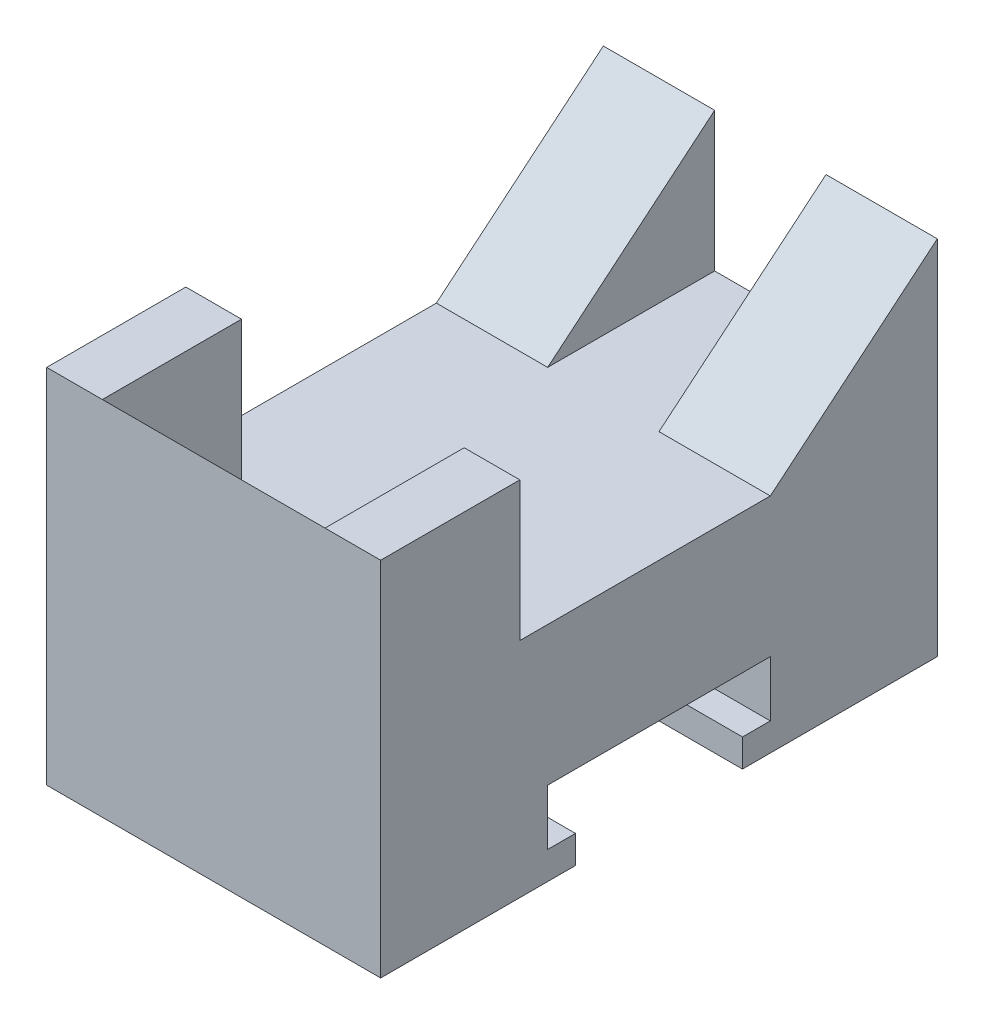
ISO-10303-21;
HEADER;
FILE_DESCRIPTION(('STEP AP214'),'2;1');
FILE_NAME('part.step','',(''),(''),'','','');
FILE_SCHEMA(('AUTOMOTIVE_DESIGN { 1 0 10303 214 1 1 1 1 }'));
ENDSEC;
DATA;
#1=APPLICATION_CONTEXT('core data for automotive mechanical design processes');
#2=APPLICATION_PROTOCOL_DEFINITION('international standard','automotive_design',2000,#1);
#3=PRODUCT_CONTEXT('',#1,'mechanical');
#4=PRODUCT('Part','Part','',(#3));
#5=PRODUCT_RELATED_PRODUCT_CATEGORY('part','',(#4));
#6=PRODUCT_DEFINITION_FORMATION('','',#4);
#7=PRODUCT_DEFINITION_CONTEXT('part definition',#1,'design');
#8=PRODUCT_DEFINITION('design','',#6,#7);
#9=PRODUCT_DEFINITION_SHAPE('','',#8);
#10=(LENGTH_UNIT() NAMED_UNIT(*) SI_UNIT(.MILLI.,.METRE.));
#11=(NAMED_UNIT(*) PLANE_ANGLE_UNIT() SI_UNIT($,.RADIAN.));
#12=(NAMED_UNIT(*) SI_UNIT($,.STERADIAN.) SOLID_ANGLE_UNIT());
#13=UNCERTAINTY_MEASURE_WITH_UNIT(LENGTH_MEASURE(1.E-05),#10,'distance_accuracy_value','');
#14=(GEOMETRIC_REPRESENTATION_CONTEXT(3) GLOBAL_UNCERTAINTY_ASSIGNED_CONTEXT((#13)) GLOBAL_UNIT_ASSIGNED_CONTEXT((#10,
#11,#12)) REPRESENTATION_CONTEXT('',''));
#15=CARTESIAN_POINT('',(0.,0.,0.));
#16=DIRECTION('',(0.,0.,1.));
#17=DIRECTION('',(1.,0.,0.));
#18=AXIS2_PLACEMENT_3D('',#15,#16,#17);
#19=CARTESIAN_POINT('',(-150.,200.,150.));
#20=DIRECTION('',(0.,0.768221279597376,0.64018439966448));
#21=DIRECTION('',(0.,-0.64018439966448,0.768221279597376));
#22=AXIS2_PLACEMENT_3D('',#19,#20,#21);
#23=PLANE('',#22);
#24=DIRECTION('',(0.,0.64018439966448,-0.768221279597376));
#25=VECTOR('',#24,1.);
#26=CARTESIAN_POINT('',(50.,200.,150.));
#27=LINE('',#26,#25);
#28=CARTESIAN_POINT('',(50.,200.,150.));
#29=VERTEX_POINT('',#28);
#30=CARTESIAN_POINT('',(50.,325.,0.));
#31=VERTEX_POINT('',#30);
#32=EDGE_CURVE('E11',#29,#31,#27,.T.);
#33=ORIENTED_EDGE('',*,*,#32,.F.);
#34=DIRECTION('',(1.,0.,0.));
#35=VECTOR('',#34,1.);
#36=CARTESIAN_POINT('',(-150.,200.,150.));
#37=LINE('',#36,#35);
#38=CARTESIAN_POINT('',(150.,200.,150.));
#39=VERTEX_POINT('',#38);
#40=EDGE_CURVE('E188',#29,#39,#37,.T.);
#41=ORIENTED_EDGE('',*,*,#40,.T.);
#42=DIRECTION('',(0.,-0.64018439966448,0.768221279597376));
#43=VECTOR('',#42,1.);
#44=CARTESIAN_POINT('',(150.,200.,150.));
#45=LINE('',#44,#43);
#46=CARTESIAN_POINT('',(150.,325.,0.));
#47=VERTEX_POINT('',#46);
#48=EDGE_CURVE('E257',#47,#39,#45,.T.);
#49=ORIENTED_EDGE('',*,*,#48,.F.);
#50=DIRECTION('',(1.,0.,0.));
#51=VECTOR('',#50,1.);
#52=CARTESIAN_POINT('',(-150.,325.,0.));
#53=LINE('',#52,#51);
#54=EDGE_CURVE('E355',#31,#47,#53,.T.);
#55=ORIENTED_EDGE('',*,*,#54,.F.);
#56=EDGE_LOOP('',(#33,#41,#49,#55));
#57=FACE_BOUND('',#56,.T.);
#58=ADVANCED_FACE('F39',(#57),#23,.T.);
#59=CARTESIAN_POINT('',(-150.,325.,500.));
#60=DIRECTION('',(0.,0.707106781186548,-0.707106781186548));
#61=DIRECTION('',(0.,0.707106781186548,0.707106781186548));
#62=AXIS2_PLACEMENT_3D('',#59,#60,#61);
#63=PLANE('',#62);
#64=DIRECTION('',(1.,0.,0.));
#65=VECTOR('',#64,1.);
#66=CARTESIAN_POINT('',(-150.,200.,375.));
#67=LINE('',#66,#65);
#68=CARTESIAN_POINT('',(-100.,200.,375.));
#69=VERTEX_POINT('',#68);
#70=CARTESIAN_POINT('',(100.,200.,375.));
#71=VERTEX_POINT('',#70);
#72=EDGE_CURVE('E396',#69,#71,#67,.T.);
#73=ORIENTED_EDGE('',*,*,#72,.F.);
#74=DIRECTION('',(0.,0.707106781186548,0.707106781186548));
#75=VECTOR('',#74,1.);
#76=CARTESIAN_POINT('',(-100.,325.,500.));
#77=LINE('',#76,#75);
#78=CARTESIAN_POINT('',(-100.,325.,500.));
#79=VERTEX_POINT('',#78);
#80=EDGE_CURVE('E224',#69,#79,#77,.T.);
#81=ORIENTED_EDGE('',*,*,#80,.T.);
#82=DIRECTION('',(1.,0.,0.));
#83=VECTOR('',#82,1.);
#84=CARTESIAN_POINT('',(-150.,325.,500.));
#85=LINE('',#84,#83);
#86=CARTESIAN_POINT('',(100.,325.,500.));
#87=VERTEX_POINT('',#86);
#88=EDGE_CURVE('E391',#79,#87,#85,.T.);
#89=ORIENTED_EDGE('',*,*,#88,.T.);
#90=DIRECTION('',(0.,-0.707106781186548,-0.707106781186548));
#91=VECTOR('',#90,1.);
#92=CARTESIAN_POINT('',(100.,325.,500.));
#93=LINE('',#92,#91);
#94=EDGE_CURVE('E359',#87,#71,#93,.T.);
#95=ORIENTED_EDGE('',*,*,#94,.T.);
#96=EDGE_LOOP('',(#73,#81,#89,#95));
#97=FACE_BOUND('',#96,.T.);
#98=ADVANCED_FACE('F433',(#97),#63,.T.);
#99=CARTESIAN_POINT('',(-150.,325.,0.));
#100=DIRECTION('',(0.,0.,-1.));
#101=DIRECTION('',(0.,1.,0.));
#102=AXIS2_PLACEMENT_3D('',#99,#100,#101);
#103=PLANE('',#102);
#104=DIRECTION('',(0.,-1.,0.));
#105=VECTOR('',#104,1.);
#106=CARTESIAN_POINT('',(50.,325.,0.));
#107=LINE('',#106,#105);
#108=CARTESIAN_POINT('',(50.,200.,0.));
#109=VERTEX_POINT('',#108);
#110=EDGE_CURVE('E195',#31,#109,#107,.T.);
#111=ORIENTED_EDGE('',*,*,#110,.F.);
#112=ORIENTED_EDGE('',*,*,#54,.T.);
#113=DIRECTION('',(0.,1.,0.));
#114=VECTOR('',#113,1.);
#115=CARTESIAN_POINT('',(150.,325.,0.));
#116=LINE('',#115,#114);
#117=CARTESIAN_POINT('',(150.,0.,0.));
#118=VERTEX_POINT('',#117);
#119=EDGE_CURVE('E253',#118,#47,#116,.T.);
#120=ORIENTED_EDGE('',*,*,#119,.F.);
#121=DIRECTION('',(1.,0.,0.));
#122=VECTOR('',#121,1.);
#123=CARTESIAN_POINT('',(-150.,0.,0.));
#124=LINE('',#123,#122);
#125=CARTESIAN_POINT('',(-150.,0.,0.));
#126=VERTEX_POINT('',#125);
#127=EDGE_CURVE('E356',#126,#118,#124,.T.);
#128=ORIENTED_EDGE('',*,*,#127,.F.);
#129=DIRECTION('',(0.,1.,0.));
#130=VECTOR('',#129,1.);
#131=CARTESIAN_POINT('',(-150.,325.,0.));
#132=LINE('',#131,#130);
#133=CARTESIAN_POINT('',(-150.,325.,0.));
#134=VERTEX_POINT('',#133);
#135=EDGE_CURVE('E304',#126,#134,#132,.T.);
#136=ORIENTED_EDGE('',*,*,#135,.T.);
#137=CARTESIAN_POINT('',(-50.,325.,0.));
#138=VERTEX_POINT('',#137);
#139=EDGE_CURVE('E401',#134,#138,#53,.T.);
#140=ORIENTED_EDGE('',*,*,#139,.T.);
#141=DIRECTION('',(0.,1.,0.));
#142=VECTOR('',#141,1.);
#143=CARTESIAN_POINT('',(-50.,325.,0.));
#144=LINE('',#143,#142);
#145=CARTESIAN_POINT('',(-50.,200.,0.));
#146=VERTEX_POINT('',#145);
#147=EDGE_CURVE('E192',#146,#138,#144,.T.);
#148=ORIENTED_EDGE('',*,*,#147,.F.);
#149=DIRECTION('',(-1.,0.,0.));
#150=VECTOR('',#149,1.);
#151=CARTESIAN_POINT('',(50.,200.,0.));
#152=LINE('',#151,#150);
#153=EDGE_CURVE('E185',#109,#146,#152,.T.);
#154=ORIENTED_EDGE('',*,*,#153,.F.);
#155=EDGE_LOOP('',(#111,#112,#120,#128,#136,#140,#148,#154));
#156=FACE_BOUND('',#155,.T.);
#157=ADVANCED_FACE('F41',(#156),#103,.T.);
#158=CARTESIAN_POINT('',(-150.,0.,0.));
#159=DIRECTION('',(0.,-1.,0.));
#160=DIRECTION('',(0.,0.,-1.));
#161=AXIS2_PLACEMENT_3D('',#158,#159,#160);
#162=PLANE('',#161);
#163=ORIENTED_EDGE('',*,*,#127,.T.);
#164=DIRECTION('',(0.,0.,-1.));
#165=VECTOR('',#164,1.);
#166=CARTESIAN_POINT('',(150.,0.,0.));
#167=LINE('',#166,#165);
#168=CARTESIAN_POINT('',(150.,0.,175.));
#169=VERTEX_POINT('',#168);
#170=EDGE_CURVE('E300',#169,#118,#167,.T.);
#171=ORIENTED_EDGE('',*,*,#170,.F.);
#172=DIRECTION('',(1.,0.,0.));
#173=VECTOR('',#172,1.);
#174=CARTESIAN_POINT('',(-150.,0.,175.));
#175=LINE('',#174,#173);
#176=CARTESIAN_POINT('',(-150.,0.,175.));
#177=VERTEX_POINT('',#176);
#178=EDGE_CURVE('E360',#177,#169,#175,.T.);
#179=ORIENTED_EDGE('',*,*,#178,.F.);
#180=DIRECTION('',(0.,0.,-1.));
#181=VECTOR('',#180,1.);
#182=CARTESIAN_POINT('',(-150.,0.,0.));
#183=LINE('',#182,#181);
#184=EDGE_CURVE('E351',#177,#126,#183,.T.);
#185=ORIENTED_EDGE('',*,*,#184,.T.);
#186=EDGE_LOOP('',(#163,#171,#179,#185));
#187=FACE_BOUND('',#186,.T.);
#188=ADVANCED_FACE('F449',(#187),#162,.T.);
#189=CARTESIAN_POINT('',(-150.,0.,175.));
#190=DIRECTION('',(0.,0.,1.));
#191=DIRECTION('',(1.,0.,0.));
#192=AXIS2_PLACEMENT_3D('',#189,#190,#191);
#193=PLANE('',#192);
#194=ORIENTED_EDGE('',*,*,#178,.T.);
#195=DIRECTION('',(0.,-1.,0.));
#196=VECTOR('',#195,1.);
#197=CARTESIAN_POINT('',(150.,0.,175.));
#198=LINE('',#197,#196);
#199=CARTESIAN_POINT('',(150.,25.,175.));
#200=VERTEX_POINT('',#199);
#201=EDGE_CURVE('E296',#200,#169,#198,.T.);
#202=ORIENTED_EDGE('',*,*,#201,.F.);
#203=DIRECTION('',(1.,0.,0.));
#204=VECTOR('',#203,1.);
#205=CARTESIAN_POINT('',(-150.,25.,175.));
#206=LINE('',#205,#204);
#207=CARTESIAN_POINT('',(-150.,25.,175.));
#208=VERTEX_POINT('',#207);
#209=EDGE_CURVE('E363',#208,#200,#206,.T.);
#210=ORIENTED_EDGE('',*,*,#209,.F.);
#211=DIRECTION('',(0.,-1.,0.));
#212=VECTOR('',#211,1.);
#213=CARTESIAN_POINT('',(-150.,0.,175.));
#214=LINE('',#213,#212);
#215=EDGE_CURVE('E347',#208,#177,#214,.T.);
#216=ORIENTED_EDGE('',*,*,#215,.T.);
#217=EDGE_LOOP('',(#194,#202,#210,#216));
#218=FACE_BOUND('',#217,.T.);
#219=ADVANCED_FACE('F530',(#218),#193,.T.);
#220=CARTESIAN_POINT('',(-150.,25.,175.));
#221=DIRECTION('',(0.,1.,0.));
#222=DIRECTION('',(0.,0.,1.));
#223=AXIS2_PLACEMENT_3D('',#220,#221,#222);
#224=PLANE('',#223);
#225=ORIENTED_EDGE('',*,*,#209,.T.);
#226=DIRECTION('',(0.,0.,1.));
#227=VECTOR('',#226,1.);
#228=CARTESIAN_POINT('',(150.,25.,175.));
#229=LINE('',#228,#227);
#230=CARTESIAN_POINT('',(150.,25.,150.));
#231=VERTEX_POINT('',#230);
#232=EDGE_CURVE('E292',#231,#200,#229,.T.);
#233=ORIENTED_EDGE('',*,*,#232,.F.);
#234=DIRECTION('',(1.,0.,0.));
#235=VECTOR('',#234,1.);
#236=CARTESIAN_POINT('',(-150.,25.,150.));
#237=LINE('',#236,#235);
#238=CARTESIAN_POINT('',(-150.,25.,150.));
#239=VERTEX_POINT('',#238);
#240=EDGE_CURVE('E366',#239,#231,#237,.T.);
#241=ORIENTED_EDGE('',*,*,#240,.F.);
#242=DIRECTION('',(0.,0.,1.));
#243=VECTOR('',#242,1.);
#244=CARTESIAN_POINT('',(-150.,25.,175.));
#245=LINE('',#244,#243);
#246=EDGE_CURVE('E343',#239,#208,#245,.T.);
#247=ORIENTED_EDGE('',*,*,#246,.T.);
#248=EDGE_LOOP('',(#225,#233,#241,#247));
#249=FACE_BOUND('',#248,.T.);
#250=ADVANCED_FACE('F456',(#249),#224,.T.);
#251=CARTESIAN_POINT('',(-150.,25.,150.));
#252=DIRECTION('',(0.,0.,1.));
#253=DIRECTION('',(1.,0.,0.));
#254=AXIS2_PLACEMENT_3D('',#251,#252,#253);
#255=PLANE('',#254);
#256=ORIENTED_EDGE('',*,*,#240,.T.);
#257=DIRECTION('',(0.,-1.,0.));
#258=VECTOR('',#257,1.);
#259=CARTESIAN_POINT('',(150.,25.,150.));
#260=LINE('',#259,#258);
#261=CARTESIAN_POINT('',(150.,75.,150.));
#262=VERTEX_POINT('',#261);
#263=EDGE_CURVE('E288',#262,#231,#260,.T.);
#264=ORIENTED_EDGE('',*,*,#263,.F.);
#265=DIRECTION('',(1.,0.,0.));
#266=VECTOR('',#265,1.);
#267=CARTESIAN_POINT('',(-150.,75.,150.));
#268=LINE('',#267,#266);
#269=CARTESIAN_POINT('',(-150.,75.,150.));
#270=VERTEX_POINT('',#269);
#271=EDGE_CURVE('E369',#270,#262,#268,.T.);
#272=ORIENTED_EDGE('',*,*,#271,.F.);
#273=DIRECTION('',(0.,-1.,0.));
#274=VECTOR('',#273,1.);
#275=CARTESIAN_POINT('',(-150.,25.,150.));
#276=LINE('',#275,#274);
#277=EDGE_CURVE('E339',#270,#239,#276,.T.);
#278=ORIENTED_EDGE('',*,*,#277,.T.);
#279=EDGE_LOOP('',(#256,#264,#272,#278));
#280=FACE_BOUND('',#279,.T.);
#281=ADVANCED_FACE('F460',(#280),#255,.T.);
#282=CARTESIAN_POINT('',(-150.,75.,150.));
#283=DIRECTION('',(0.,-1.,0.));
#284=DIRECTION('',(0.,0.,-1.));
#285=AXIS2_PLACEMENT_3D('',#282,#283,#284);
#286=PLANE('',#285);
#287=ORIENTED_EDGE('',*,*,#271,.T.);
#288=DIRECTION('',(0.,0.,-1.));
#289=VECTOR('',#288,1.);
#290=CARTESIAN_POINT('',(150.,75.,150.));
#291=LINE('',#290,#289);
#292=CARTESIAN_POINT('',(150.,75.,350.));
#293=VERTEX_POINT('',#292);
#294=EDGE_CURVE('E284',#293,#262,#291,.T.);
#295=ORIENTED_EDGE('',*,*,#294,.F.);
#296=DIRECTION('',(1.,0.,0.));
#297=VECTOR('',#296,1.);
#298=CARTESIAN_POINT('',(-150.,75.,350.));
#299=LINE('',#298,#297);
#300=CARTESIAN_POINT('',(-150.,75.,350.));
#301=VERTEX_POINT('',#300);
#302=EDGE_CURVE('E372',#301,#293,#299,.T.);
#303=ORIENTED_EDGE('',*,*,#302,.F.);
#304=DIRECTION('',(0.,0.,-1.));
#305=VECTOR('',#304,1.);
#306=CARTESIAN_POINT('',(-150.,75.,150.));
#307=LINE('',#306,#305);
#308=EDGE_CURVE('E335',#301,#270,#307,.T.);
#309=ORIENTED_EDGE('',*,*,#308,.T.);
#310=EDGE_LOOP('',(#287,#295,#303,#309));
#311=FACE_BOUND('',#310,.T.);
#312=ADVANCED_FACE('F464',(#311),#286,.T.);
#313=CARTESIAN_POINT('',(-150.,75.,350.));
#314=DIRECTION('',(0.,0.,-1.));
#315=DIRECTION('',(0.,1.,0.));
#316=AXIS2_PLACEMENT_3D('',#313,#314,#315);
#317=PLANE('',#316);
#318=ORIENTED_EDGE('',*,*,#302,.T.);
#319=DIRECTION('',(0.,1.,0.));
#320=VECTOR('',#319,1.);
#321=CARTESIAN_POINT('',(150.,75.,350.));
#322=LINE('',#321,#320);
#323=CARTESIAN_POINT('',(150.,25.,350.));
#324=VERTEX_POINT('',#323);
#325=EDGE_CURVE('E280',#324,#293,#322,.T.);
#326=ORIENTED_EDGE('',*,*,#325,.F.);
#327=DIRECTION('',(1.,0.,0.));
#328=VECTOR('',#327,1.);
#329=CARTESIAN_POINT('',(-150.,25.,350.));
#330=LINE('',#329,#328);
#331=CARTESIAN_POINT('',(-150.,25.,350.));
#332=VERTEX_POINT('',#331);
#333=EDGE_CURVE('E375',#332,#324,#330,.T.);
#334=ORIENTED_EDGE('',*,*,#333,.F.);
#335=DIRECTION('',(0.,1.,0.));
#336=VECTOR('',#335,1.);
#337=CARTESIAN_POINT('',(-150.,75.,350.));
#338=LINE('',#337,#336);
#339=EDGE_CURVE('E331',#332,#301,#338,.T.);
#340=ORIENTED_EDGE('',*,*,#339,.T.);
#341=EDGE_LOOP('',(#318,#326,#334,#340));
#342=FACE_BOUND('',#341,.T.);
#343=ADVANCED_FACE('F469',(#342),#317,.T.);
#344=CARTESIAN_POINT('',(-150.,25.,350.));
#345=DIRECTION('',(0.,1.,0.));
#346=DIRECTION('',(0.,0.,1.));
#347=AXIS2_PLACEMENT_3D('',#344,#345,#346);
#348=PLANE('',#347);
#349=ORIENTED_EDGE('',*,*,#333,.T.);
#350=DIRECTION('',(0.,0.,1.));
#351=VECTOR('',#350,1.);
#352=CARTESIAN_POINT('',(150.,25.,350.));
#353=LINE('',#352,#351);
#354=CARTESIAN_POINT('',(150.,25.,325.));
#355=VERTEX_POINT('',#354);
#356=EDGE_CURVE('E276',#355,#324,#353,.T.);
#357=ORIENTED_EDGE('',*,*,#356,.F.);
#358=DIRECTION('',(1.,0.,0.));
#359=VECTOR('',#358,1.);
#360=CARTESIAN_POINT('',(-150.,25.,325.));
#361=LINE('',#360,#359);
#362=CARTESIAN_POINT('',(-150.,25.,325.));
#363=VERTEX_POINT('',#362);
#364=EDGE_CURVE('E378',#363,#355,#361,.T.);
#365=ORIENTED_EDGE('',*,*,#364,.F.);
#366=DIRECTION('',(0.,0.,1.));
#367=VECTOR('',#366,1.);
#368=CARTESIAN_POINT('',(-150.,25.,350.));
#369=LINE('',#368,#367);
#370=EDGE_CURVE('E327',#363,#332,#369,.T.);
#371=ORIENTED_EDGE('',*,*,#370,.T.);
#372=EDGE_LOOP('',(#349,#357,#365,#371));
#373=FACE_BOUND('',#372,.T.);
#374=ADVANCED_FACE('F472',(#373),#348,.T.);
#375=CARTESIAN_POINT('',(-150.,25.,325.));
#376=DIRECTION('',(0.,0.,-1.));
#377=DIRECTION('',(-1.,0.,0.));
#378=AXIS2_PLACEMENT_3D('',#375,#376,#377);
#379=PLANE('',#378);
#380=ORIENTED_EDGE('',*,*,#364,.T.);
#381=DIRECTION('',(0.,1.,0.));
#382=VECTOR('',#381,1.);
#383=CARTESIAN_POINT('',(150.,25.,325.));
#384=LINE('',#383,#382);
#385=CARTESIAN_POINT('',(150.,0.,325.));
#386=VERTEX_POINT('',#385);
#387=EDGE_CURVE('E272',#386,#355,#384,.T.);
#388=ORIENTED_EDGE('',*,*,#387,.F.);
#389=DIRECTION('',(1.,0.,0.));
#390=VECTOR('',#389,1.);
#391=CARTESIAN_POINT('',(-150.,0.,325.));
#392=LINE('',#391,#390);
#393=CARTESIAN_POINT('',(-150.,0.,325.));
#394=VERTEX_POINT('',#393);
#395=EDGE_CURVE('E381',#394,#386,#392,.T.);
#396=ORIENTED_EDGE('',*,*,#395,.F.);
#397=DIRECTION('',(0.,1.,0.));
#398=VECTOR('',#397,1.);
#399=CARTESIAN_POINT('',(-150.,25.,325.));
#400=LINE('',#399,#398);
#401=EDGE_CURVE('E323',#394,#363,#400,.T.);
#402=ORIENTED_EDGE('',*,*,#401,.T.);
#403=EDGE_LOOP('',(#380,#388,#396,#402));
#404=FACE_BOUND('',#403,.T.);
#405=ADVANCED_FACE('F476',(#404),#379,.T.);
#406=CARTESIAN_POINT('',(-150.,0.,325.));
#407=DIRECTION('',(0.,-1.,0.));
#408=DIRECTION('',(0.,0.,-1.));
#409=AXIS2_PLACEMENT_3D('',#406,#407,#408);
#410=PLANE('',#409);
#411=ORIENTED_EDGE('',*,*,#395,.T.);
#412=DIRECTION('',(0.,0.,-1.));
#413=VECTOR('',#412,1.);
#414=CARTESIAN_POINT('',(150.,0.,325.));
#415=LINE('',#414,#413);
#416=CARTESIAN_POINT('',(150.,0.,500.));
#417=VERTEX_POINT('',#416);
#418=EDGE_CURVE('E268',#417,#386,#415,.T.);
#419=ORIENTED_EDGE('',*,*,#418,.F.);
#420=DIRECTION('',(1.,0.,0.));
#421=VECTOR('',#420,1.);
#422=CARTESIAN_POINT('',(-150.,0.,500.));
#423=LINE('',#422,#421);
#424=CARTESIAN_POINT('',(-150.,0.,500.));
#425=VERTEX_POINT('',#424);
#426=EDGE_CURVE('E384',#425,#417,#423,.T.);
#427=ORIENTED_EDGE('',*,*,#426,.F.);
#428=DIRECTION('',(0.,0.,-1.));
#429=VECTOR('',#428,1.);
#430=CARTESIAN_POINT('',(-150.,0.,325.));
#431=LINE('',#430,#429);
#432=EDGE_CURVE('E319',#425,#394,#431,.T.);
#433=ORIENTED_EDGE('',*,*,#432,.T.);
#434=EDGE_LOOP('',(#411,#419,#427,#433));
#435=FACE_BOUND('',#434,.T.);
#436=ADVANCED_FACE('F481',(#435),#410,.T.);
#437=CARTESIAN_POINT('',(-150.,0.,500.));
#438=DIRECTION('',(0.,0.,1.));
#439=DIRECTION('',(0.,-1.,0.));
#440=AXIS2_PLACEMENT_3D('',#437,#438,#439);
#441=PLANE('',#440);
#442=ORIENTED_EDGE('',*,*,#88,.F.);
#443=CARTESIAN_POINT('',(-150.,325.,500.));
#444=VERTEX_POINT('',#443);
#445=EDGE_CURVE('E388',#444,#79,#85,.T.);
#446=ORIENTED_EDGE('',*,*,#445,.F.);
#447=DIRECTION('',(0.,-1.,0.));
#448=VECTOR('',#447,1.);
#449=CARTESIAN_POINT('',(-150.,0.,500.));
#450=LINE('',#449,#448);
#451=EDGE_CURVE('E316',#444,#425,#450,.T.);
#452=ORIENTED_EDGE('',*,*,#451,.T.);
#453=ORIENTED_EDGE('',*,*,#426,.T.);
#454=DIRECTION('',(0.,-1.,0.));
#455=VECTOR('',#454,1.);
#456=CARTESIAN_POINT('',(150.,0.,500.));
#457=LINE('',#456,#455);
#458=CARTESIAN_POINT('',(150.,325.,500.));
#459=VERTEX_POINT('',#458);
#460=EDGE_CURVE('E265',#459,#417,#457,.T.);
#461=ORIENTED_EDGE('',*,*,#460,.F.);
#462=DIRECTION('',(1.,0.,0.));
#463=VECTOR('',#462,1.);
#464=CARTESIAN_POINT('',(150.,325.,500.));
#465=LINE('',#464,#463);
#466=EDGE_CURVE('E237',#87,#459,#465,.T.);
#467=ORIENTED_EDGE('',*,*,#466,.F.);
#468=EDGE_LOOP('',(#442,#446,#452,#453,#461,#467));
#469=FACE_BOUND('',#468,.T.);
#470=ADVANCED_FACE('F483',(#469),#441,.T.);
#471=CARTESIAN_POINT('',(-150.,200.,375.));
#472=DIRECTION('',(0.,1.,0.));
#473=DIRECTION('',(0.,0.,1.));
#474=AXIS2_PLACEMENT_3D('',#471,#472,#473);
#475=PLANE('',#474);
#476=ORIENTED_EDGE('',*,*,#40,.F.);
#477=DIRECTION('',(0.,0.,-1.));
#478=VECTOR('',#477,1.);
#479=CARTESIAN_POINT('',(50.,200.,230.));
#480=LINE('',#479,#478);
#481=EDGE_CURVE('E181',#29,#109,#480,.T.);
#482=ORIENTED_EDGE('',*,*,#481,.T.);
#483=ORIENTED_EDGE('',*,*,#153,.T.);
#484=DIRECTION('',(0.,0.,-1.));
#485=VECTOR('',#484,1.);
#486=CARTESIAN_POINT('',(-50.,200.,230.));
#487=LINE('',#486,#485);
#488=CARTESIAN_POINT('',(-50.,200.,150.));
#489=VERTEX_POINT('',#488);
#490=EDGE_CURVE('E55',#489,#146,#487,.T.);
#491=ORIENTED_EDGE('',*,*,#490,.F.);
#492=CARTESIAN_POINT('',(-150.,200.,150.));
#493=VERTEX_POINT('',#492);
#494=EDGE_CURVE('E397',#493,#489,#37,.T.);
#495=ORIENTED_EDGE('',*,*,#494,.F.);
#496=DIRECTION('',(0.,0.,1.));
#497=VECTOR('',#496,1.);
#498=CARTESIAN_POINT('',(-150.,200.,375.));
#499=LINE('',#498,#497);
#500=CARTESIAN_POINT('',(-150.,200.,375.));
#501=VERTEX_POINT('',#500);
#502=EDGE_CURVE('E312',#493,#501,#499,.T.);
#503=ORIENTED_EDGE('',*,*,#502,.T.);
#504=EDGE_CURVE('E392',#501,#69,#67,.T.);
#505=ORIENTED_EDGE('',*,*,#504,.T.);
#506=ORIENTED_EDGE('',*,*,#72,.T.);
#507=DIRECTION('',(-1.,0.,0.));
#508=VECTOR('',#507,1.);
#509=CARTESIAN_POINT('',(100.,200.,375.));
#510=LINE('',#509,#508);
#511=CARTESIAN_POINT('',(150.,200.,375.));
#512=VERTEX_POINT('',#511);
#513=EDGE_CURVE('E228',#512,#71,#510,.T.);
#514=ORIENTED_EDGE('',*,*,#513,.F.);
#515=DIRECTION('',(0.,0.,1.));
#516=VECTOR('',#515,1.);
#517=CARTESIAN_POINT('',(150.,200.,375.));
#518=LINE('',#517,#516);
#519=EDGE_CURVE('E261',#39,#512,#518,.T.);
#520=ORIENTED_EDGE('',*,*,#519,.F.);
#521=EDGE_LOOP('',(#476,#482,#483,#491,#495,#503,#505,#506,#514,#520));
#522=FACE_BOUND('',#521,.T.);
#523=ADVANCED_FACE('F183',(#522),#475,.T.);
#524=DIRECTION('',(0.,-0.64018439966448,0.768221279597376));
#525=VECTOR('',#524,1.);
#526=CARTESIAN_POINT('',(-50.,200.,150.));
#527=LINE('',#526,#525);
#528=EDGE_CURVE('E48',#138,#489,#527,.T.);
#529=ORIENTED_EDGE('',*,*,#528,.F.);
#530=ORIENTED_EDGE('',*,*,#139,.F.);
#531=DIRECTION('',(0.,-0.64018439966448,0.768221279597376));
#532=VECTOR('',#531,1.);
#533=CARTESIAN_POINT('',(-150.,200.,150.));
#534=LINE('',#533,#532);
#535=EDGE_CURVE('E308',#134,#493,#534,.T.);
#536=ORIENTED_EDGE('',*,*,#535,.T.);
#537=ORIENTED_EDGE('',*,*,#494,.T.);
#538=EDGE_LOOP('',(#529,#530,#536,#537));
#539=FACE_BOUND('',#538,.T.);
#540=ADVANCED_FACE('F411',(#539),#23,.T.);
#541=CARTESIAN_POINT('',(-150.,0.,0.));
#542=DIRECTION('',(-1.,0.,0.));
#543=DIRECTION('',(0.,0.,1.));
#544=AXIS2_PLACEMENT_3D('',#541,#542,#543);
#545=PLANE('',#544);
#546=ORIENTED_EDGE('',*,*,#451,.F.);
#547=DIRECTION('',(0.,0.,1.));
#548=VECTOR('',#547,1.);
#549=CARTESIAN_POINT('',(-150.,325.,375.));
#550=LINE('',#549,#548);
#551=CARTESIAN_POINT('',(-150.,325.,375.));
#552=VERTEX_POINT('',#551);
#553=EDGE_CURVE('E208',#552,#444,#550,.T.);
#554=ORIENTED_EDGE('',*,*,#553,.F.);
#555=DIRECTION('',(0.,-1.,0.));
#556=VECTOR('',#555,1.);
#557=CARTESIAN_POINT('',(-150.,325.,375.));
#558=LINE('',#557,#556);
#559=EDGE_CURVE('E218',#552,#501,#558,.T.);
#560=ORIENTED_EDGE('',*,*,#559,.T.);
#561=ORIENTED_EDGE('',*,*,#502,.F.);
#562=ORIENTED_EDGE('',*,*,#535,.F.);
#563=ORIENTED_EDGE('',*,*,#135,.F.);
#564=ORIENTED_EDGE('',*,*,#184,.F.);
#565=ORIENTED_EDGE('',*,*,#215,.F.);
#566=ORIENTED_EDGE('',*,*,#246,.F.);
#567=ORIENTED_EDGE('',*,*,#277,.F.);
#568=ORIENTED_EDGE('',*,*,#308,.F.);
#569=ORIENTED_EDGE('',*,*,#339,.F.);
#570=ORIENTED_EDGE('',*,*,#370,.F.);
#571=ORIENTED_EDGE('',*,*,#401,.F.);
#572=ORIENTED_EDGE('',*,*,#432,.F.);
#573=EDGE_LOOP('',(#546,#554,#560,#561,#562,#563,#564,#565,#566,#567,#568,#569,#570,#571,#572));
#574=FACE_BOUND('',#573,.T.);
#575=ADVANCED_FACE('F416',(#574),#545,.T.);
#576=CARTESIAN_POINT('',(150.,0.,0.));
#577=DIRECTION('',(-1.,0.,0.));
#578=DIRECTION('',(0.,0.,1.));
#579=AXIS2_PLACEMENT_3D('',#576,#577,#578);
#580=PLANE('',#579);
#581=ORIENTED_EDGE('',*,*,#519,.T.);
#582=DIRECTION('',(0.,-1.,0.));
#583=VECTOR('',#582,1.);
#584=CARTESIAN_POINT('',(150.,325.,375.));
#585=LINE('',#584,#583);
#586=CARTESIAN_POINT('',(150.,325.,375.));
#587=VERTEX_POINT('',#586);
#588=EDGE_CURVE('E243',#587,#512,#585,.T.);
#589=ORIENTED_EDGE('',*,*,#588,.F.);
#590=DIRECTION('',(0.,0.,-1.));
#591=VECTOR('',#590,1.);
#592=CARTESIAN_POINT('',(150.,325.,375.));
#593=LINE('',#592,#591);
#594=EDGE_CURVE('E240',#459,#587,#593,.T.);
#595=ORIENTED_EDGE('',*,*,#594,.F.);
#596=ORIENTED_EDGE('',*,*,#460,.T.);
#597=ORIENTED_EDGE('',*,*,#418,.T.);
#598=ORIENTED_EDGE('',*,*,#387,.T.);
#599=ORIENTED_EDGE('',*,*,#356,.T.);
#600=ORIENTED_EDGE('',*,*,#325,.T.);
#601=ORIENTED_EDGE('',*,*,#294,.T.);
#602=ORIENTED_EDGE('',*,*,#263,.T.);
#603=ORIENTED_EDGE('',*,*,#232,.T.);
#604=ORIENTED_EDGE('',*,*,#201,.T.);
#605=ORIENTED_EDGE('',*,*,#170,.T.);
#606=ORIENTED_EDGE('',*,*,#119,.T.);
#607=ORIENTED_EDGE('',*,*,#48,.T.);
#608=EDGE_LOOP('',(#581,#589,#595,#596,#597,#598,#599,#600,#601,#602,#603,#604,#605,#606,#607));
#609=FACE_BOUND('',#608,.T.);
#610=ADVANCED_FACE('F445',(#609),#580,.F.);
#611=CARTESIAN_POINT('',(100.,325.,375.));
#612=DIRECTION('',(0.,0.,1.));
#613=DIRECTION('',(1.,0.,0.));
#614=AXIS2_PLACEMENT_3D('',#611,#612,#613);
#615=PLANE('',#614);
#616=ORIENTED_EDGE('',*,*,#513,.T.);
#617=DIRECTION('',(0.,-1.,0.));
#618=VECTOR('',#617,1.);
#619=CARTESIAN_POINT('',(100.,325.,375.));
#620=LINE('',#619,#618);
#621=CARTESIAN_POINT('',(100.,325.,375.));
#622=VERTEX_POINT('',#621);
#623=EDGE_CURVE('E249',#622,#71,#620,.T.);
#624=ORIENTED_EDGE('',*,*,#623,.F.);
#625=DIRECTION('',(-1.,0.,0.));
#626=VECTOR('',#625,1.);
#627=CARTESIAN_POINT('',(100.,325.,375.));
#628=LINE('',#627,#626);
#629=EDGE_CURVE('E229',#587,#622,#628,.T.);
#630=ORIENTED_EDGE('',*,*,#629,.F.);
#631=ORIENTED_EDGE('',*,*,#588,.T.);
#632=EDGE_LOOP('',(#616,#624,#630,#631));
#633=FACE_BOUND('',#632,.T.);
#634=ADVANCED_FACE('F431',(#633),#615,.F.);
#635=CARTESIAN_POINT('',(100.,325.,500.));
#636=DIRECTION('',(1.,0.,0.));
#637=DIRECTION('',(0.,0.,-1.));
#638=AXIS2_PLACEMENT_3D('',#635,#636,#637);
#639=PLANE('',#638);
#640=ORIENTED_EDGE('',*,*,#94,.F.);
#641=DIRECTION('',(0.,0.,1.));
#642=VECTOR('',#641,1.);
#643=CARTESIAN_POINT('',(100.,325.,500.));
#644=LINE('',#643,#642);
#645=EDGE_CURVE('E233',#622,#87,#644,.T.);
#646=ORIENTED_EDGE('',*,*,#645,.F.);
#647=ORIENTED_EDGE('',*,*,#623,.T.);
#648=EDGE_LOOP('',(#640,#646,#647));
#649=FACE_BOUND('',#648,.T.);
#650=ADVANCED_FACE('F428',(#649),#639,.F.);
#651=CARTESIAN_POINT('',(0.,325.,0.));
#652=DIRECTION('',(0.,-1.,0.));
#653=DIRECTION('',(0.,0.,-1.));
#654=AXIS2_PLACEMENT_3D('',#651,#652,#653);
#655=PLANE('',#654);
#656=ORIENTED_EDGE('',*,*,#629,.T.);
#657=ORIENTED_EDGE('',*,*,#645,.T.);
#658=ORIENTED_EDGE('',*,*,#466,.T.);
#659=ORIENTED_EDGE('',*,*,#594,.T.);
#660=EDGE_LOOP('',(#656,#657,#658,#659));
#661=FACE_BOUND('',#660,.T.);
#662=ADVANCED_FACE('F490',(#661),#655,.F.);
#663=CARTESIAN_POINT('',(-100.,325.,500.));
#664=DIRECTION('',(-1.,0.,0.));
#665=DIRECTION('',(0.,0.,1.));
#666=AXIS2_PLACEMENT_3D('',#663,#664,#665);
#667=PLANE('',#666);
#668=ORIENTED_EDGE('',*,*,#80,.F.);
#669=DIRECTION('',(0.,-1.,0.));
#670=VECTOR('',#669,1.);
#671=CARTESIAN_POINT('',(-100.,325.,375.));
#672=LINE('',#671,#670);
#673=CARTESIAN_POINT('',(-100.,325.,375.));
#674=VERTEX_POINT('',#673);
#675=EDGE_CURVE('E63',#674,#69,#672,.T.);
#676=ORIENTED_EDGE('',*,*,#675,.F.);
#677=DIRECTION('',(0.,0.,-1.));
#678=VECTOR('',#677,1.);
#679=CARTESIAN_POINT('',(-100.,325.,500.));
#680=LINE('',#679,#678);
#681=EDGE_CURVE('E212',#79,#674,#680,.T.);
#682=ORIENTED_EDGE('',*,*,#681,.F.);
#683=EDGE_LOOP('',(#668,#676,#682));
#684=FACE_BOUND('',#683,.T.);
#685=ADVANCED_FACE('F488',(#684),#667,.F.);
#686=CARTESIAN_POINT('',(-100.,325.,375.));
#687=DIRECTION('',(0.,0.,1.));
#688=DIRECTION('',(1.,0.,0.));
#689=AXIS2_PLACEMENT_3D('',#686,#687,#688);
#690=PLANE('',#689);
#691=ORIENTED_EDGE('',*,*,#504,.F.);
#692=ORIENTED_EDGE('',*,*,#559,.F.);
#693=DIRECTION('',(-1.,0.,0.));
#694=VECTOR('',#693,1.);
#695=CARTESIAN_POINT('',(-100.,325.,375.));
#696=LINE('',#695,#694);
#697=EDGE_CURVE('E215',#674,#552,#696,.T.);
#698=ORIENTED_EDGE('',*,*,#697,.F.);
#699=ORIENTED_EDGE('',*,*,#675,.T.);
#700=EDGE_LOOP('',(#691,#692,#698,#699));
#701=FACE_BOUND('',#700,.T.);
#702=ADVANCED_FACE('F420',(#701),#690,.F.);
#703=CARTESIAN_POINT('',(0.,325.,0.));
#704=DIRECTION('',(0.,1.,0.));
#705=DIRECTION('',(0.,0.,1.));
#706=AXIS2_PLACEMENT_3D('',#703,#704,#705);
#707=PLANE('',#706);
#708=ORIENTED_EDGE('',*,*,#553,.T.);
#709=ORIENTED_EDGE('',*,*,#445,.T.);
#710=ORIENTED_EDGE('',*,*,#681,.T.);
#711=ORIENTED_EDGE('',*,*,#697,.T.);
#712=EDGE_LOOP('',(#708,#709,#710,#711));
#713=FACE_BOUND('',#712,.T.);
#714=ADVANCED_FACE('F486',(#713),#707,.T.);
#715=CARTESIAN_POINT('',(50.,325.,230.));
#716=DIRECTION('',(1.,0.,0.));
#717=DIRECTION('',(0.,1.,0.));
#718=AXIS2_PLACEMENT_3D('',#715,#716,#717);
#719=PLANE('',#718);
#720=ORIENTED_EDGE('',*,*,#32,.T.);
#721=ORIENTED_EDGE('',*,*,#110,.T.);
#722=ORIENTED_EDGE('',*,*,#481,.F.);
#723=EDGE_LOOP('',(#720,#721,#722));
#724=FACE_BOUND('',#723,.T.);
#725=ADVANCED_FACE('F196',(#724),#719,.F.);
#726=CARTESIAN_POINT('',(-50.,325.,230.));
#727=DIRECTION('',(-1.,0.,0.));
#728=DIRECTION('',(0.,-1.,0.));
#729=AXIS2_PLACEMENT_3D('',#726,#727,#728);
#730=PLANE('',#729);
#731=ORIENTED_EDGE('',*,*,#528,.T.);
#732=ORIENTED_EDGE('',*,*,#490,.T.);
#733=ORIENTED_EDGE('',*,*,#147,.T.);
#734=EDGE_LOOP('',(#731,#732,#733));
#735=FACE_BOUND('',#734,.T.);
#736=ADVANCED_FACE('F409',(#735),#730,.F.);
#737=CLOSED_SHELL('',(#58,#98,#157,#188,#219,#250,#281,#312,#343,#374,#405,#436,#470,#523,#540,
#575,#610,#634,#650,#662,#685,#702,#714,#725,#736));
#738=MANIFOLD_SOLID_BREP('B2',#737);
#739=ADVANCED_BREP_SHAPE_REPRESENTATION('',(#18,#738),#14);
#740=SHAPE_DEFINITION_REPRESENTATION(#9,#739);
ENDSEC;
END-ISO-10303-21;
